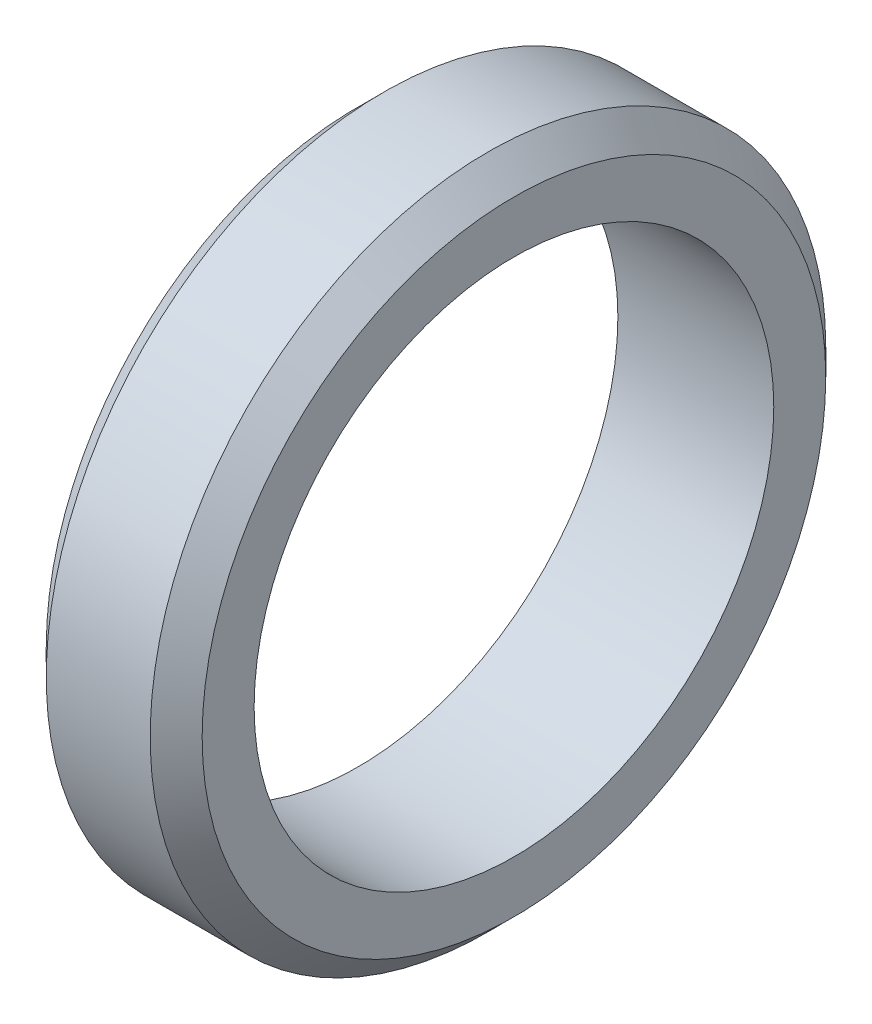
ISO-10303-21;
HEADER;
FILE_DESCRIPTION(('STEP AP214'),'2;1');
FILE_NAME('part.step','',(''),(''),'','','');
FILE_SCHEMA(('AUTOMOTIVE_DESIGN { 1 0 10303 214 1 1 1 1 }'));
ENDSEC;
DATA;
#1=APPLICATION_CONTEXT('core data for automotive mechanical design processes');
#2=APPLICATION_PROTOCOL_DEFINITION('international standard','automotive_design',2000,#1);
#3=PRODUCT_CONTEXT('',#1,'mechanical');
#4=PRODUCT('Part','Part','',(#3));
#5=PRODUCT_RELATED_PRODUCT_CATEGORY('part','',(#4));
#6=PRODUCT_DEFINITION_FORMATION('','',#4);
#7=PRODUCT_DEFINITION_CONTEXT('part definition',#1,'design');
#8=PRODUCT_DEFINITION('design','',#6,#7);
#9=PRODUCT_DEFINITION_SHAPE('','',#8);
#10=(LENGTH_UNIT() NAMED_UNIT(*) SI_UNIT(.MILLI.,.METRE.));
#11=(NAMED_UNIT(*) PLANE_ANGLE_UNIT() SI_UNIT($,.RADIAN.));
#12=(NAMED_UNIT(*) SI_UNIT($,.STERADIAN.) SOLID_ANGLE_UNIT());
#13=UNCERTAINTY_MEASURE_WITH_UNIT(LENGTH_MEASURE(1.E-05),#10,'distance_accuracy_value','');
#14=(GEOMETRIC_REPRESENTATION_CONTEXT(3) GLOBAL_UNCERTAINTY_ASSIGNED_CONTEXT((#13)) GLOBAL_UNIT_ASSIGNED_CONTEXT((#10,
#11,#12)) REPRESENTATION_CONTEXT('',''));
#15=CARTESIAN_POINT('',(0.,0.,0.));
#16=DIRECTION('',(0.,0.,1.));
#17=DIRECTION('',(1.,0.,0.));
#18=AXIS2_PLACEMENT_3D('',#15,#16,#17);
#19=CARTESIAN_POINT('',(0.,6.,0.));
#20=DIRECTION('',(-1.,0.,0.));
#21=DIRECTION('',(0.,0.,1.));
#22=AXIS2_PLACEMENT_3D('',#19,#20,#21);
#23=PLANE('',#22);
#24=CARTESIAN_POINT('',(0.,0.,0.));
#25=DIRECTION('',(1.,0.,0.));
#26=DIRECTION('',(0.,0.,-1.));
#27=AXIS2_PLACEMENT_3D('',#24,#25,#26);
#28=CIRCLE('',#27,5.);
#29=CARTESIAN_POINT('',(0.,0.,-5.));
#30=VERTEX_POINT('',#29);
#31=EDGE_CURVE('E37',#30,#30,#28,.T.);
#32=ORIENTED_EDGE('',*,*,#31,.T.);
#33=EDGE_LOOP('',(#32));
#34=FACE_BOUND('',#33,.T.);
#35=CARTESIAN_POINT('',(0.,0.,0.));
#36=DIRECTION('',(1.,0.,0.));
#37=DIRECTION('',(0.,0.,-1.));
#38=AXIS2_PLACEMENT_3D('',#35,#36,#37);
#39=CIRCLE('',#38,6.);
#40=CARTESIAN_POINT('',(0.,0.,-6.));
#41=VERTEX_POINT('',#40);
#42=EDGE_CURVE('E34',#41,#41,#39,.T.);
#43=ORIENTED_EDGE('',*,*,#42,.F.);
#44=EDGE_LOOP('',(#43));
#45=FACE_BOUND('',#44,.T.);
#46=ADVANCED_FACE('F14',(#34,#45),#23,.T.);
#47=CARTESIAN_POINT('',(3.,0.,0.));
#48=DIRECTION('',(1.,0.,0.));
#49=DIRECTION('',(0.,0.,-1.));
#50=AXIS2_PLACEMENT_3D('',#47,#48,#49);
#51=CYLINDRICAL_SURFACE('',#50,5.);
#52=CARTESIAN_POINT('',(3.,0.,0.));
#53=DIRECTION('',(1.,0.,0.));
#54=DIRECTION('',(0.,0.,-1.));
#55=AXIS2_PLACEMENT_3D('',#52,#53,#54);
#56=CIRCLE('',#55,5.);
#57=CARTESIAN_POINT('',(3.,0.,-5.));
#58=VERTEX_POINT('',#57);
#59=EDGE_CURVE('E29',#58,#58,#56,.T.);
#60=ORIENTED_EDGE('',*,*,#59,.T.);
#61=EDGE_LOOP('',(#60));
#62=FACE_BOUND('',#61,.T.);
#63=ORIENTED_EDGE('',*,*,#31,.F.);
#64=EDGE_LOOP('',(#63));
#65=FACE_BOUND('',#64,.T.);
#66=ADVANCED_FACE('F43',(#62,#65),#51,.F.);
#67=CARTESIAN_POINT('',(0.5,0.,0.));
#68=DIRECTION('',(1.,0.,0.));
#69=DIRECTION('',(0.,0.,-1.));
#70=AXIS2_PLACEMENT_3D('',#67,#68,#69);
#71=CONICAL_SURFACE('',#70,6.5,0.785398163397449);
#72=ORIENTED_EDGE('',*,*,#42,.T.);
#73=EDGE_LOOP('',(#72));
#74=FACE_BOUND('',#73,.T.);
#75=CARTESIAN_POINT('',(0.5,0.,0.));
#76=DIRECTION('',(1.,0.,0.));
#77=DIRECTION('',(0.,0.,-1.));
#78=AXIS2_PLACEMENT_3D('',#75,#76,#77);
#79=CIRCLE('',#78,6.5);
#80=CARTESIAN_POINT('',(0.5,0.,-6.5));
#81=VERTEX_POINT('',#80);
#82=EDGE_CURVE('E25',#81,#81,#79,.T.);
#83=ORIENTED_EDGE('',*,*,#82,.F.);
#84=EDGE_LOOP('',(#83));
#85=FACE_BOUND('',#84,.T.);
#86=ADVANCED_FACE('F45',(#74,#85),#71,.T.);
#87=CARTESIAN_POINT('',(3.,5.,0.));
#88=DIRECTION('',(1.,0.,0.));
#89=DIRECTION('',(0.,0.,-1.));
#90=AXIS2_PLACEMENT_3D('',#87,#88,#89);
#91=PLANE('',#90);
#92=CARTESIAN_POINT('',(3.,0.,0.));
#93=DIRECTION('',(1.,0.,0.));
#94=DIRECTION('',(0.,0.,-1.));
#95=AXIS2_PLACEMENT_3D('',#92,#93,#94);
#96=CIRCLE('',#95,6.);
#97=CARTESIAN_POINT('',(3.,0.,-6.));
#98=VERTEX_POINT('',#97);
#99=EDGE_CURVE('E21',#98,#98,#96,.T.);
#100=ORIENTED_EDGE('',*,*,#99,.T.);
#101=EDGE_LOOP('',(#100));
#102=FACE_BOUND('',#101,.T.);
#103=ORIENTED_EDGE('',*,*,#59,.F.);
#104=EDGE_LOOP('',(#103));
#105=FACE_BOUND('',#104,.T.);
#106=ADVANCED_FACE('F53',(#102,#105),#91,.T.);
#107=CARTESIAN_POINT('',(3.,0.,0.));
#108=DIRECTION('',(1.,0.,0.));
#109=DIRECTION('',(0.,0.,-1.));
#110=AXIS2_PLACEMENT_3D('',#107,#108,#109);
#111=CYLINDRICAL_SURFACE('',#110,6.5);
#112=ORIENTED_EDGE('',*,*,#82,.T.);
#113=EDGE_LOOP('',(#112));
#114=FACE_BOUND('',#113,.T.);
#115=CARTESIAN_POINT('',(2.5,0.,0.));
#116=DIRECTION('',(1.,0.,0.));
#117=DIRECTION('',(0.,0.,-1.));
#118=AXIS2_PLACEMENT_3D('',#115,#116,#117);
#119=CIRCLE('',#118,6.5);
#120=CARTESIAN_POINT('',(2.5,0.,-6.5));
#121=VERTEX_POINT('',#120);
#122=EDGE_CURVE('E10',#121,#121,#119,.T.);
#123=ORIENTED_EDGE('',*,*,#122,.F.);
#124=EDGE_LOOP('',(#123));
#125=FACE_BOUND('',#124,.T.);
#126=ADVANCED_FACE('F59',(#114,#125),#111,.T.);
#127=CARTESIAN_POINT('',(3.,0.,0.));
#128=DIRECTION('',(-1.,0.,0.));
#129=DIRECTION('',(0.,0.,1.));
#130=AXIS2_PLACEMENT_3D('',#127,#128,#129);
#131=CONICAL_SURFACE('',#130,6.,0.785398163397449);
#132=ORIENTED_EDGE('',*,*,#122,.T.);
#133=EDGE_LOOP('',(#132));
#134=FACE_BOUND('',#133,.T.);
#135=ORIENTED_EDGE('',*,*,#99,.F.);
#136=EDGE_LOOP('',(#135));
#137=FACE_BOUND('',#136,.T.);
#138=ADVANCED_FACE('F16',(#134,#137),#131,.T.);
#139=CLOSED_SHELL('',(#46,#66,#86,#106,#126,#138));
#140=MANIFOLD_SOLID_BREP('B1',#139);
#141=ADVANCED_BREP_SHAPE_REPRESENTATION('',(#18,#140),#14);
#142=SHAPE_DEFINITION_REPRESENTATION(#9,#141);
ENDSEC;
END-ISO-10303-21;
